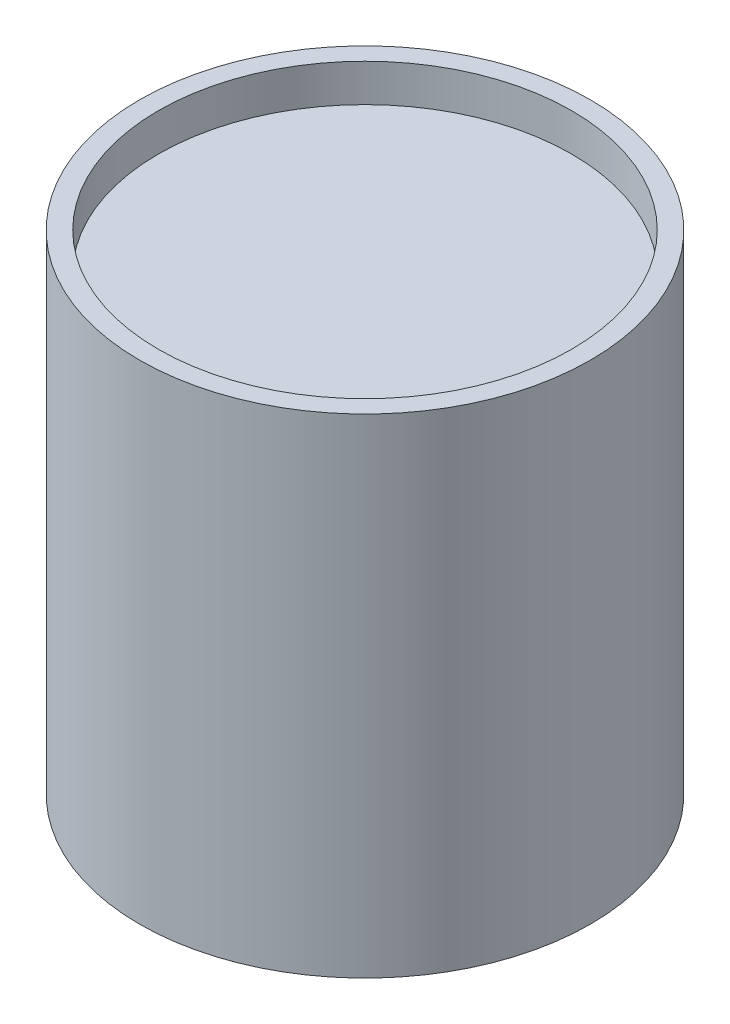
ISO-10303-21;
HEADER;
FILE_DESCRIPTION(('STEP AP214'),'2;1');
FILE_NAME('part.step','',(''),(''),'','','');
FILE_SCHEMA(('AUTOMOTIVE_DESIGN { 1 0 10303 214 1 1 1 1 }'));
ENDSEC;
DATA;
#1=APPLICATION_CONTEXT('core data for automotive mechanical design processes');
#2=APPLICATION_PROTOCOL_DEFINITION('international standard','automotive_design',2000,#1);
#3=PRODUCT_CONTEXT('',#1,'mechanical');
#4=PRODUCT('Part','Part','',(#3));
#5=PRODUCT_RELATED_PRODUCT_CATEGORY('part','',(#4));
#6=PRODUCT_DEFINITION_FORMATION('','',#4);
#7=PRODUCT_DEFINITION_CONTEXT('part definition',#1,'design');
#8=PRODUCT_DEFINITION('design','',#6,#7);
#9=PRODUCT_DEFINITION_SHAPE('','',#8);
#10=(LENGTH_UNIT() NAMED_UNIT(*) SI_UNIT(.MILLI.,.METRE.));
#11=(NAMED_UNIT(*) PLANE_ANGLE_UNIT() SI_UNIT($,.RADIAN.));
#12=(NAMED_UNIT(*) SI_UNIT($,.STERADIAN.) SOLID_ANGLE_UNIT());
#13=UNCERTAINTY_MEASURE_WITH_UNIT(LENGTH_MEASURE(1.E-05),#10,'distance_accuracy_value','');
#14=(GEOMETRIC_REPRESENTATION_CONTEXT(3) GLOBAL_UNCERTAINTY_ASSIGNED_CONTEXT((#13)) GLOBAL_UNIT_ASSIGNED_CONTEXT((#10,
#11,#12)) REPRESENTATION_CONTEXT('',''));
#15=CARTESIAN_POINT('',(0.,0.,0.));
#16=DIRECTION('',(0.,0.,1.));
#17=DIRECTION('',(1.,0.,0.));
#18=AXIS2_PLACEMENT_3D('',#15,#16,#17);
#19=CARTESIAN_POINT('',(0.,65.,0.));
#20=DIRECTION('',(0.,-1.,0.));
#21=DIRECTION('',(0.,0.,-1.));
#22=AXIS2_PLACEMENT_3D('',#19,#20,#21);
#23=CYLINDRICAL_SURFACE('',#22,30.);
#24=CARTESIAN_POINT('',(0.,65.,0.));
#25=DIRECTION('',(0.,1.,0.));
#26=DIRECTION('',(0.,0.,1.));
#27=AXIS2_PLACEMENT_3D('',#24,#25,#26);
#28=CIRCLE('',#27,30.);
#29=CARTESIAN_POINT('',(0.,65.,30.));
#30=VERTEX_POINT('',#29);
#31=EDGE_CURVE('E11',#30,#30,#28,.T.);
#32=ORIENTED_EDGE('',*,*,#31,.F.);
#33=EDGE_LOOP('',(#32));
#34=FACE_BOUND('',#33,.T.);
#35=CARTESIAN_POINT('',(0.,0.,0.));
#36=DIRECTION('',(0.,1.,0.));
#37=DIRECTION('',(0.,0.,1.));
#38=AXIS2_PLACEMENT_3D('',#35,#36,#37);
#39=CIRCLE('',#38,30.);
#40=CARTESIAN_POINT('',(0.,0.,30.));
#41=VERTEX_POINT('',#40);
#42=EDGE_CURVE('E42',#41,#41,#39,.T.);
#43=ORIENTED_EDGE('',*,*,#42,.T.);
#44=EDGE_LOOP('',(#43));
#45=FACE_BOUND('',#44,.T.);
#46=ADVANCED_FACE('F39',(#34,#45),#23,.T.);
#47=CARTESIAN_POINT('',(0.,65.,0.));
#48=DIRECTION('',(0.,1.,0.));
#49=DIRECTION('',(0.,0.,1.));
#50=AXIS2_PLACEMENT_3D('',#47,#48,#49);
#51=PLANE('',#50);
#52=CARTESIAN_POINT('',(0.,65.,0.));
#53=DIRECTION('',(0.,1.,0.));
#54=DIRECTION('',(0.,0.,1.));
#55=AXIS2_PLACEMENT_3D('',#52,#53,#54);
#56=CIRCLE('',#55,27.5);
#57=CARTESIAN_POINT('',(0.,65.,27.5));
#58=VERTEX_POINT('',#57);
#59=EDGE_CURVE('E51',#58,#58,#56,.T.);
#60=ORIENTED_EDGE('',*,*,#59,.F.);
#61=EDGE_LOOP('',(#60));
#62=FACE_BOUND('',#61,.T.);
#63=ORIENTED_EDGE('',*,*,#31,.T.);
#64=EDGE_LOOP('',(#63));
#65=FACE_BOUND('',#64,.T.);
#66=ADVANCED_FACE('F70',(#62,#65),#51,.T.);
#67=CARTESIAN_POINT('',(0.,0.,0.));
#68=DIRECTION('',(0.,1.,0.));
#69=DIRECTION('',(0.,0.,1.));
#70=AXIS2_PLACEMENT_3D('',#67,#68,#69);
#71=PLANE('',#70);
#72=CARTESIAN_POINT('',(0.,0.,0.));
#73=DIRECTION('',(0.,-1.,0.));
#74=DIRECTION('',(0.,0.,-1.));
#75=AXIS2_PLACEMENT_3D('',#72,#73,#74);
#76=CIRCLE('',#75,27.5);
#77=CARTESIAN_POINT('',(0.,0.,-27.5));
#78=VERTEX_POINT('',#77);
#79=EDGE_CURVE('E59',#78,#78,#76,.T.);
#80=ORIENTED_EDGE('',*,*,#79,.F.);
#81=EDGE_LOOP('',(#80));
#82=FACE_BOUND('',#81,.T.);
#83=ORIENTED_EDGE('',*,*,#42,.F.);
#84=EDGE_LOOP('',(#83));
#85=FACE_BOUND('',#84,.T.);
#86=ADVANCED_FACE('F66',(#82,#85),#71,.F.);
#87=CARTESIAN_POINT('',(0.,60.,0.));
#88=DIRECTION('',(0.,1.,0.));
#89=DIRECTION('',(0.,0.,1.));
#90=AXIS2_PLACEMENT_3D('',#87,#88,#89);
#91=CYLINDRICAL_SURFACE('',#90,27.5);
#92=CARTESIAN_POINT('',(0.,60.,0.));
#93=DIRECTION('',(0.,1.,0.));
#94=DIRECTION('',(0.,0.,1.));
#95=AXIS2_PLACEMENT_3D('',#92,#93,#94);
#96=CIRCLE('',#95,27.5);
#97=CARTESIAN_POINT('',(0.,60.,27.5));
#98=VERTEX_POINT('',#97);
#99=EDGE_CURVE('E49',#98,#98,#96,.T.);
#100=ORIENTED_EDGE('',*,*,#99,.F.);
#101=EDGE_LOOP('',(#100));
#102=FACE_BOUND('',#101,.T.);
#103=ORIENTED_EDGE('',*,*,#59,.T.);
#104=EDGE_LOOP('',(#103));
#105=FACE_BOUND('',#104,.T.);
#106=ADVANCED_FACE('F69',(#102,#105),#91,.F.);
#107=CARTESIAN_POINT('',(0.,60.,0.));
#108=DIRECTION('',(0.,1.,0.));
#109=DIRECTION('',(0.,0.,1.));
#110=AXIS2_PLACEMENT_3D('',#107,#108,#109);
#111=PLANE('',#110);
#112=ORIENTED_EDGE('',*,*,#99,.T.);
#113=EDGE_LOOP('',(#112));
#114=FACE_BOUND('',#113,.T.);
#115=ADVANCED_FACE('F86',(#114),#111,.T.);
#116=CARTESIAN_POINT('',(0.,57.,0.));
#117=DIRECTION('',(0.,1.,0.));
#118=DIRECTION('',(0.,0.,1.));
#119=AXIS2_PLACEMENT_3D('',#116,#117,#118);
#120=PLANE('',#119);
#121=CARTESIAN_POINT('',(0.,57.,0.));
#122=DIRECTION('',(0.,1.,0.));
#123=DIRECTION('',(0.,0.,1.));
#124=AXIS2_PLACEMENT_3D('',#121,#122,#123);
#125=CIRCLE('',#124,27.5);
#126=CARTESIAN_POINT('',(0.,57.,27.5));
#127=VERTEX_POINT('',#126);
#128=EDGE_CURVE('E54',#127,#127,#125,.F.);
#129=ORIENTED_EDGE('',*,*,#128,.T.);
#130=EDGE_LOOP('',(#129));
#131=FACE_BOUND('',#130,.T.);
#132=ADVANCED_FACE('F90',(#131),#120,.F.);
#133=CARTESIAN_POINT('',(0.,137.78174593052,0.));
#134=DIRECTION('',(0.,-1.,0.));
#135=DIRECTION('',(0.,0.,-1.));
#136=AXIS2_PLACEMENT_3D('',#133,#134,#135);
#137=CYLINDRICAL_SURFACE('',#136,27.5);
#138=ORIENTED_EDGE('',*,*,#79,.T.);
#139=EDGE_LOOP('',(#138));
#140=FACE_BOUND('',#139,.T.);
#141=ORIENTED_EDGE('',*,*,#128,.F.);
#142=EDGE_LOOP('',(#141));
#143=FACE_BOUND('',#142,.T.);
#144=ADVANCED_FACE('F63',(#140,#143),#137,.F.);
#145=CLOSED_SHELL('',(#46,#66,#86,#106,#115,#132,#144));
#146=MANIFOLD_SOLID_BREP('B2',#145);
#147=ADVANCED_BREP_SHAPE_REPRESENTATION('',(#18,#146),#14);
#148=SHAPE_DEFINITION_REPRESENTATION(#9,#147);
ENDSEC;
END-ISO-10303-21;
